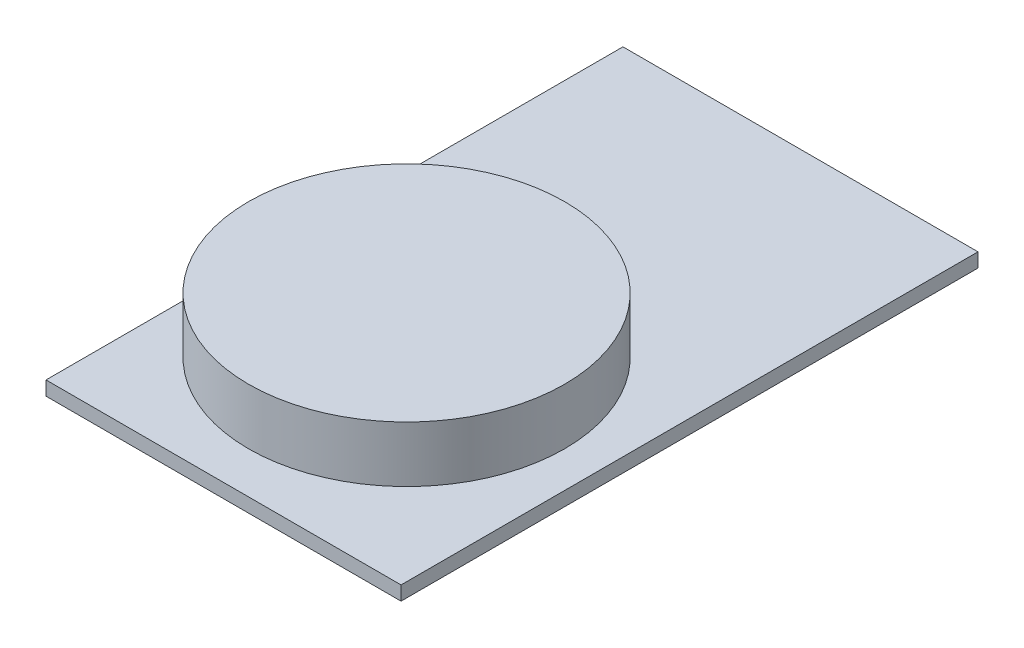
ISO-10303-21;
HEADER;
FILE_DESCRIPTION(('STEP AP214'),'2;1');
FILE_NAME('part.step','',(''),(''),'','','');
FILE_SCHEMA(('AUTOMOTIVE_DESIGN { 1 0 10303 214 1 1 1 1 }'));
ENDSEC;
DATA;
#1=APPLICATION_CONTEXT('core data for automotive mechanical design processes');
#2=APPLICATION_PROTOCOL_DEFINITION('international standard','automotive_design',2000,#1);
#3=PRODUCT_CONTEXT('',#1,'mechanical');
#4=PRODUCT('Part','Part','',(#3));
#5=PRODUCT_RELATED_PRODUCT_CATEGORY('part','',(#4));
#6=PRODUCT_DEFINITION_FORMATION('','',#4);
#7=PRODUCT_DEFINITION_CONTEXT('part definition',#1,'design');
#8=PRODUCT_DEFINITION('design','',#6,#7);
#9=PRODUCT_DEFINITION_SHAPE('','',#8);
#10=(LENGTH_UNIT() NAMED_UNIT(*) SI_UNIT(.MILLI.,.METRE.));
#11=(NAMED_UNIT(*) PLANE_ANGLE_UNIT() SI_UNIT($,.RADIAN.));
#12=(NAMED_UNIT(*) SI_UNIT($,.STERADIAN.) SOLID_ANGLE_UNIT());
#13=UNCERTAINTY_MEASURE_WITH_UNIT(LENGTH_MEASURE(1.E-05),#10,'distance_accuracy_value','');
#14=(GEOMETRIC_REPRESENTATION_CONTEXT(3) GLOBAL_UNCERTAINTY_ASSIGNED_CONTEXT((#13)) GLOBAL_UNIT_ASSIGNED_CONTEXT((#10,
#11,#12)) REPRESENTATION_CONTEXT('',''));
#15=CARTESIAN_POINT('',(0.,0.,0.));
#16=DIRECTION('',(0.,0.,1.));
#17=DIRECTION('',(1.,0.,0.));
#18=AXIS2_PLACEMENT_3D('',#15,#16,#17);
#19=CARTESIAN_POINT('',(0.,12.6,0.));
#20=DIRECTION('',(0.,-1.,0.));
#21=DIRECTION('',(0.,0.,-1.));
#22=AXIS2_PLACEMENT_3D('',#19,#20,#21);
#23=CYLINDRICAL_SURFACE('',#22,71.25);
#24=CARTESIAN_POINT('',(0.,12.6,0.));
#25=DIRECTION('',(0.,1.,0.));
#26=DIRECTION('',(0.,0.,1.));
#27=AXIS2_PLACEMENT_3D('',#24,#25,#26);
#28=CIRCLE('',#27,71.25);
#29=CARTESIAN_POINT('',(0.,12.6,71.25));
#30=VERTEX_POINT('',#29);
#31=EDGE_CURVE('E11',#30,#30,#28,.T.);
#32=ORIENTED_EDGE('',*,*,#31,.F.);
#33=EDGE_LOOP('',(#32));
#34=FACE_BOUND('',#33,.T.);
#35=CARTESIAN_POINT('',(0.,-12.6,0.));
#36=DIRECTION('',(0.,1.,0.));
#37=DIRECTION('',(0.,0.,1.));
#38=AXIS2_PLACEMENT_3D('',#35,#36,#37);
#39=CIRCLE('',#38,71.25);
#40=CARTESIAN_POINT('',(0.,-12.6,71.25));
#41=VERTEX_POINT('',#40);
#42=EDGE_CURVE('E42',#41,#41,#39,.T.);
#43=ORIENTED_EDGE('',*,*,#42,.T.);
#44=EDGE_LOOP('',(#43));
#45=FACE_BOUND('',#44,.T.);
#46=ADVANCED_FACE('F39',(#34,#45),#23,.T.);
#47=CARTESIAN_POINT('',(0.,12.6,0.));
#48=DIRECTION('',(0.,1.,0.));
#49=DIRECTION('',(0.,0.,1.));
#50=AXIS2_PLACEMENT_3D('',#47,#48,#49);
#51=PLANE('',#50);
#52=ORIENTED_EDGE('',*,*,#31,.T.);
#53=EDGE_LOOP('',(#52));
#54=FACE_BOUND('',#53,.T.);
#55=ADVANCED_FACE('F135',(#54),#51,.T.);
#56=CARTESIAN_POINT('',(-72.5,-18.95,90.));
#57=DIRECTION('',(1.,0.,0.));
#58=DIRECTION('',(0.,0.,-1.));
#59=AXIS2_PLACEMENT_3D('',#56,#57,#58);
#60=PLANE('',#59);
#61=DIRECTION('',(0.,0.,-1.));
#62=VECTOR('',#61,1.);
#63=CARTESIAN_POINT('',(-72.5,-12.6,90.));
#64=LINE('',#63,#62);
#65=CARTESIAN_POINT('',(-72.5,-12.6,90.));
#66=VERTEX_POINT('',#65);
#67=CARTESIAN_POINT('',(-72.5,-12.6,-170.));
#68=VERTEX_POINT('',#67);
#69=EDGE_CURVE('E106',#66,#68,#64,.T.);
#70=ORIENTED_EDGE('',*,*,#69,.T.);
#71=DIRECTION('',(0.,1.,0.));
#72=VECTOR('',#71,1.);
#73=CARTESIAN_POINT('',(-72.5,-18.95,-170.));
#74=LINE('',#73,#72);
#75=CARTESIAN_POINT('',(-72.5,-18.95,-170.));
#76=VERTEX_POINT('',#75);
#77=EDGE_CURVE('E97',#76,#68,#74,.T.);
#78=ORIENTED_EDGE('',*,*,#77,.F.);
#79=DIRECTION('',(0.,0.,-1.));
#80=VECTOR('',#79,1.);
#81=CARTESIAN_POINT('',(-72.5,-18.95,90.));
#82=LINE('',#81,#80);
#83=CARTESIAN_POINT('',(-72.5,-18.95,90.));
#84=VERTEX_POINT('',#83);
#85=EDGE_CURVE('E91',#84,#76,#82,.T.);
#86=ORIENTED_EDGE('',*,*,#85,.F.);
#87=DIRECTION('',(0.,1.,0.));
#88=VECTOR('',#87,1.);
#89=CARTESIAN_POINT('',(-72.5,-18.95,90.));
#90=LINE('',#89,#88);
#91=EDGE_CURVE('E102',#84,#66,#90,.T.);
#92=ORIENTED_EDGE('',*,*,#91,.T.);
#93=EDGE_LOOP('',(#70,#78,#86,#92));
#94=FACE_BOUND('',#93,.T.);
#95=ADVANCED_FACE('F124',(#94),#60,.F.);
#96=CARTESIAN_POINT('',(-72.5,-18.95,-170.));
#97=DIRECTION('',(0.,0.,1.));
#98=DIRECTION('',(1.,0.,0.));
#99=AXIS2_PLACEMENT_3D('',#96,#97,#98);
#100=PLANE('',#99);
#101=DIRECTION('',(1.,0.,0.));
#102=VECTOR('',#101,1.);
#103=CARTESIAN_POINT('',(-72.5,-12.6,-170.));
#104=LINE('',#103,#102);
#105=CARTESIAN_POINT('',(87.5,-12.6,-170.));
#106=VERTEX_POINT('',#105);
#107=EDGE_CURVE('E96',#68,#106,#104,.T.);
#108=ORIENTED_EDGE('',*,*,#107,.T.);
#109=DIRECTION('',(0.,1.,0.));
#110=VECTOR('',#109,1.);
#111=CARTESIAN_POINT('',(87.5,-18.95,-170.));
#112=LINE('',#111,#110);
#113=CARTESIAN_POINT('',(87.5,-18.95,-170.));
#114=VERTEX_POINT('',#113);
#115=EDGE_CURVE('E94',#114,#106,#112,.T.);
#116=ORIENTED_EDGE('',*,*,#115,.F.);
#117=DIRECTION('',(1.,0.,0.));
#118=VECTOR('',#117,1.);
#119=CARTESIAN_POINT('',(-72.5,-18.95,-170.));
#120=LINE('',#119,#118);
#121=EDGE_CURVE('E86',#76,#114,#120,.T.);
#122=ORIENTED_EDGE('',*,*,#121,.F.);
#123=ORIENTED_EDGE('',*,*,#77,.T.);
#124=EDGE_LOOP('',(#108,#116,#122,#123));
#125=FACE_BOUND('',#124,.T.);
#126=ADVANCED_FACE('F95',(#125),#100,.F.);
#127=CARTESIAN_POINT('',(87.5,-18.95,90.));
#128=DIRECTION('',(-1.,0.,0.));
#129=DIRECTION('',(0.,0.,1.));
#130=AXIS2_PLACEMENT_3D('',#127,#128,#129);
#131=PLANE('',#130);
#132=DIRECTION('',(0.,0.,1.));
#133=VECTOR('',#132,1.);
#134=CARTESIAN_POINT('',(87.5,-12.6,90.));
#135=LINE('',#134,#133);
#136=CARTESIAN_POINT('',(87.5,-12.6,90.));
#137=VERTEX_POINT('',#136);
#138=EDGE_CURVE('E72',#106,#137,#135,.T.);
#139=ORIENTED_EDGE('',*,*,#138,.T.);
#140=DIRECTION('',(0.,1.,0.));
#141=VECTOR('',#140,1.);
#142=CARTESIAN_POINT('',(87.5,-18.95,90.));
#143=LINE('',#142,#141);
#144=CARTESIAN_POINT('',(87.5,-18.95,90.));
#145=VERTEX_POINT('',#144);
#146=EDGE_CURVE('E98',#145,#137,#143,.T.);
#147=ORIENTED_EDGE('',*,*,#146,.F.);
#148=DIRECTION('',(0.,0.,1.));
#149=VECTOR('',#148,1.);
#150=CARTESIAN_POINT('',(87.5,-18.95,90.));
#151=LINE('',#150,#149);
#152=EDGE_CURVE('E89',#114,#145,#151,.T.);
#153=ORIENTED_EDGE('',*,*,#152,.F.);
#154=ORIENTED_EDGE('',*,*,#115,.T.);
#155=EDGE_LOOP('',(#139,#147,#153,#154));
#156=FACE_BOUND('',#155,.T.);
#157=ADVANCED_FACE('F100',(#156),#131,.F.);
#158=CARTESIAN_POINT('',(-72.5,-18.95,90.));
#159=DIRECTION('',(0.,0.,-1.));
#160=DIRECTION('',(-1.,0.,0.));
#161=AXIS2_PLACEMENT_3D('',#158,#159,#160);
#162=PLANE('',#161);
#163=DIRECTION('',(-1.,0.,0.));
#164=VECTOR('',#163,1.);
#165=CARTESIAN_POINT('',(-72.5,-12.6,90.));
#166=LINE('',#165,#164);
#167=EDGE_CURVE('E78',#137,#66,#166,.T.);
#168=ORIENTED_EDGE('',*,*,#167,.T.);
#169=ORIENTED_EDGE('',*,*,#91,.F.);
#170=DIRECTION('',(-1.,0.,0.));
#171=VECTOR('',#170,1.);
#172=CARTESIAN_POINT('',(-72.5,-18.95,90.));
#173=LINE('',#172,#171);
#174=EDGE_CURVE('E55',#145,#84,#173,.T.);
#175=ORIENTED_EDGE('',*,*,#174,.F.);
#176=ORIENTED_EDGE('',*,*,#146,.T.);
#177=EDGE_LOOP('',(#168,#169,#175,#176));
#178=FACE_BOUND('',#177,.T.);
#179=ADVANCED_FACE('F125',(#178),#162,.F.);
#180=CARTESIAN_POINT('',(0.,-18.95,0.));
#181=DIRECTION('',(0.,-1.,0.));
#182=DIRECTION('',(0.,0.,-1.));
#183=AXIS2_PLACEMENT_3D('',#180,#181,#182);
#184=PLANE('',#183);
#185=ORIENTED_EDGE('',*,*,#85,.T.);
#186=ORIENTED_EDGE('',*,*,#121,.T.);
#187=ORIENTED_EDGE('',*,*,#152,.T.);
#188=ORIENTED_EDGE('',*,*,#174,.T.);
#189=EDGE_LOOP('',(#185,#186,#187,#188));
#190=FACE_BOUND('',#189,.T.);
#191=ADVANCED_FACE('F87',(#190),#184,.T.);
#192=CARTESIAN_POINT('',(0.,-12.6,0.));
#193=DIRECTION('',(0.,-1.,0.));
#194=DIRECTION('',(0.,0.,-1.));
#195=AXIS2_PLACEMENT_3D('',#192,#193,#194);
#196=PLANE('',#195);
#197=ORIENTED_EDGE('',*,*,#42,.F.);
#198=EDGE_LOOP('',(#197));
#199=FACE_BOUND('',#198,.T.);
#200=ORIENTED_EDGE('',*,*,#69,.F.);
#201=ORIENTED_EDGE('',*,*,#167,.F.);
#202=ORIENTED_EDGE('',*,*,#138,.F.);
#203=ORIENTED_EDGE('',*,*,#107,.F.);
#204=EDGE_LOOP('',(#200,#201,#202,#203));
#205=FACE_BOUND('',#204,.T.);
#206=ADVANCED_FACE('F118',(#199,#205),#196,.F.);
#207=CLOSED_SHELL('',(#46,#55,#95,#126,#157,#179,#191,#206));
#208=MANIFOLD_SOLID_BREP('B2',#207);
#209=ADVANCED_BREP_SHAPE_REPRESENTATION('',(#18,#208),#14);
#210=SHAPE_DEFINITION_REPRESENTATION(#9,#209);
ENDSEC;
END-ISO-10303-21;
